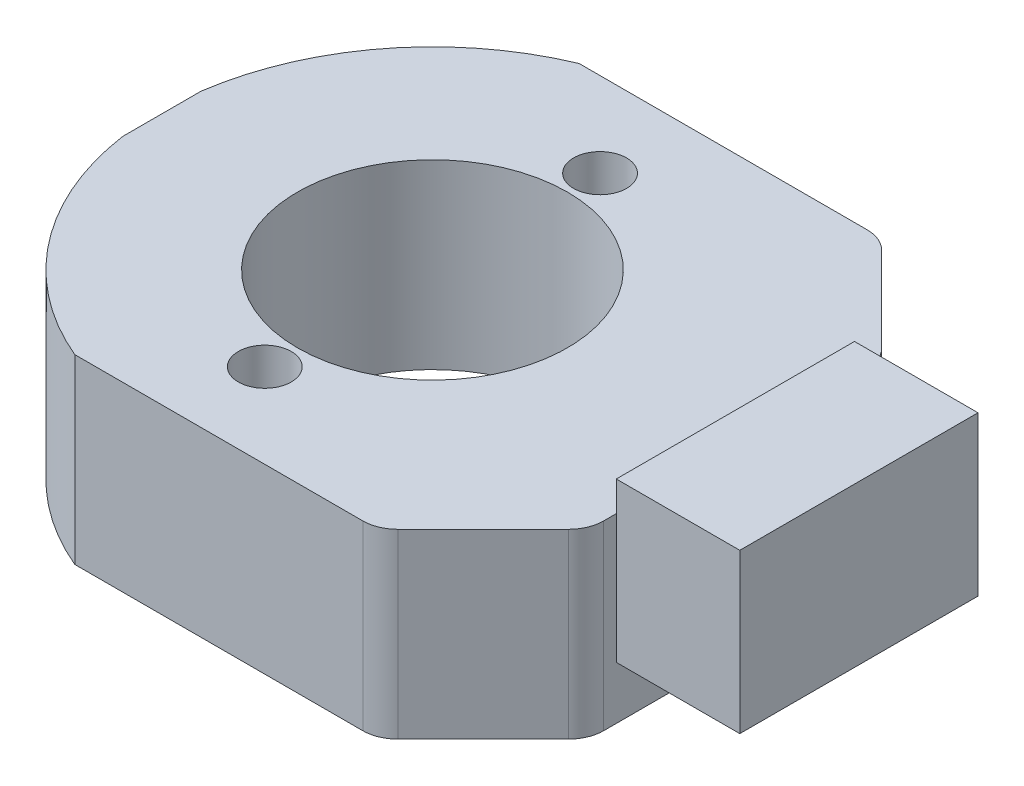
ISO-10303-21;
HEADER;
FILE_DESCRIPTION(('STEP AP214'),'2;1');
FILE_NAME('part.step','',(''),(''),'','','');
FILE_SCHEMA(('AUTOMOTIVE_DESIGN { 1 0 10303 214 1 1 1 1 }'));
ENDSEC;
DATA;
#1=APPLICATION_CONTEXT('core data for automotive mechanical design processes');
#2=APPLICATION_PROTOCOL_DEFINITION('international standard','automotive_design',2000,#1);
#3=PRODUCT_CONTEXT('',#1,'mechanical');
#4=PRODUCT('Part','Part','',(#3));
#5=PRODUCT_RELATED_PRODUCT_CATEGORY('part','',(#4));
#6=PRODUCT_DEFINITION_FORMATION('','',#4);
#7=PRODUCT_DEFINITION_CONTEXT('part definition',#1,'design');
#8=PRODUCT_DEFINITION('design','',#6,#7);
#9=PRODUCT_DEFINITION_SHAPE('','',#8);
#10=(LENGTH_UNIT() NAMED_UNIT(*) SI_UNIT(.MILLI.,.METRE.));
#11=(NAMED_UNIT(*) PLANE_ANGLE_UNIT() SI_UNIT($,.RADIAN.));
#12=(NAMED_UNIT(*) SI_UNIT($,.STERADIAN.) SOLID_ANGLE_UNIT());
#13=UNCERTAINTY_MEASURE_WITH_UNIT(LENGTH_MEASURE(1.E-05),#10,'distance_accuracy_value','');
#14=(GEOMETRIC_REPRESENTATION_CONTEXT(3) GLOBAL_UNCERTAINTY_ASSIGNED_CONTEXT((#13)) GLOBAL_UNIT_ASSIGNED_CONTEXT((#10,
#11,#12)) REPRESENTATION_CONTEXT('',''));
#15=CARTESIAN_POINT('',(0.,0.,0.));
#16=DIRECTION('',(0.,0.,1.));
#17=DIRECTION('',(1.,0.,0.));
#18=AXIS2_PLACEMENT_3D('',#15,#16,#17);
#19=CARTESIAN_POINT('',(17.17,10.3,0.));
#20=DIRECTION('',(1.,0.,0.));
#21=DIRECTION('',(0.,0.,-1.));
#22=AXIS2_PLACEMENT_3D('',#19,#20,#21);
#23=PLANE('',#22);
#24=DIRECTION('',(0.,0.,1.));
#25=VECTOR('',#24,1.);
#26=CARTESIAN_POINT('',(17.17,3.,-6.75));
#27=LINE('',#26,#25);
#28=CARTESIAN_POINT('',(17.17,3.,-6.75));
#29=VERTEX_POINT('',#28);
#30=CARTESIAN_POINT('',(17.17,3.,6.75));
#31=VERTEX_POINT('',#30);
#32=EDGE_CURVE('E58',#29,#31,#27,.T.);
#33=ORIENTED_EDGE('',*,*,#32,.T.);
#34=DIRECTION('',(0.,-1.,0.));
#35=VECTOR('',#34,1.);
#36=CARTESIAN_POINT('',(17.17,12.,6.75));
#37=LINE('',#36,#35);
#38=CARTESIAN_POINT('',(17.17,10.3,6.75));
#39=VERTEX_POINT('',#38);
#40=EDGE_CURVE('E188',#39,#31,#37,.T.);
#41=ORIENTED_EDGE('',*,*,#40,.F.);
#42=DIRECTION('',(0.,0.,1.));
#43=VECTOR('',#42,1.);
#44=CARTESIAN_POINT('',(17.17,10.3,0.));
#45=LINE('',#44,#43);
#46=CARTESIAN_POINT('',(17.17,10.3,7.4615728752538));
#47=VERTEX_POINT('',#46);
#48=EDGE_CURVE('E217',#39,#47,#45,.T.);
#49=ORIENTED_EDGE('',*,*,#48,.T.);
#50=DIRECTION('',(0.,-1.,0.));
#51=VECTOR('',#50,1.);
#52=CARTESIAN_POINT('',(17.17,10.3,7.4615728752538));
#53=LINE('',#52,#51);
#54=CARTESIAN_POINT('',(17.17,0.,7.4615728752538));
#55=VERTEX_POINT('',#54);
#56=EDGE_CURVE('E289',#47,#55,#53,.T.);
#57=ORIENTED_EDGE('',*,*,#56,.T.);
#58=DIRECTION('',(0.,0.,1.));
#59=VECTOR('',#58,1.);
#60=CARTESIAN_POINT('',(17.17,0.,0.));
#61=LINE('',#60,#59);
#62=CARTESIAN_POINT('',(17.17,0.,-7.46157287525379));
#63=VERTEX_POINT('',#62);
#64=EDGE_CURVE('E236',#63,#55,#61,.T.);
#65=ORIENTED_EDGE('',*,*,#64,.F.);
#66=DIRECTION('',(0.,-1.,0.));
#67=VECTOR('',#66,1.);
#68=CARTESIAN_POINT('',(17.17,10.3,-7.46157287525379));
#69=LINE('',#68,#67);
#70=CARTESIAN_POINT('',(17.17,10.3,-7.46157287525379));
#71=VERTEX_POINT('',#70);
#72=EDGE_CURVE('E292',#63,#71,#69,.F.);
#73=ORIENTED_EDGE('',*,*,#72,.T.);
#74=CARTESIAN_POINT('',(17.17,10.3,-6.75));
#75=VERTEX_POINT('',#74);
#76=EDGE_CURVE('E218',#71,#75,#45,.T.);
#77=ORIENTED_EDGE('',*,*,#76,.T.);
#78=DIRECTION('',(0.,-1.,0.));
#79=VECTOR('',#78,1.);
#80=CARTESIAN_POINT('',(17.17,12.,-6.75));
#81=LINE('',#80,#79);
#82=EDGE_CURVE('E63',#75,#29,#81,.T.);
#83=ORIENTED_EDGE('',*,*,#82,.T.);
#84=EDGE_LOOP('',(#33,#41,#49,#57,#65,#73,#77,#83));
#85=FACE_BOUND('',#84,.T.);
#86=ADVANCED_FACE('F43',(#85),#23,.T.);
#87=CARTESIAN_POINT('',(-15.33,10.3,0.));
#88=DIRECTION('',(1.,0.,0.));
#89=DIRECTION('',(0.,0.,-1.));
#90=AXIS2_PLACEMENT_3D('',#87,#88,#89);
#91=PLANE('',#90);
#92=DIRECTION('',(0.,0.,1.));
#93=VECTOR('',#92,1.);
#94=CARTESIAN_POINT('',(-15.33,0.,0.));
#95=LINE('',#94,#93);
#96=CARTESIAN_POINT('',(-15.33,0.,-2.22063054108513));
#97=VERTEX_POINT('',#96);
#98=CARTESIAN_POINT('',(-15.33,0.,2.22063054108513));
#99=VERTEX_POINT('',#98);
#100=EDGE_CURVE('E228',#97,#99,#95,.T.);
#101=ORIENTED_EDGE('',*,*,#100,.T.);
#102=DIRECTION('',(0.,-1.,0.));
#103=VECTOR('',#102,1.);
#104=CARTESIAN_POINT('',(-15.33,10.3,2.22063054108513));
#105=LINE('',#104,#103);
#106=CARTESIAN_POINT('',(-15.33,10.3,2.22063054108513));
#107=VERTEX_POINT('',#106);
#108=EDGE_CURVE('E250',#107,#99,#105,.T.);
#109=ORIENTED_EDGE('',*,*,#108,.F.);
#110=DIRECTION('',(0.,0.,1.));
#111=VECTOR('',#110,1.);
#112=CARTESIAN_POINT('',(-15.33,10.3,0.));
#113=LINE('',#112,#111);
#114=CARTESIAN_POINT('',(-15.33,10.3,-2.22063054108513));
#115=VERTEX_POINT('',#114);
#116=EDGE_CURVE('E208',#115,#107,#113,.T.);
#117=ORIENTED_EDGE('',*,*,#116,.F.);
#118=DIRECTION('',(0.,-1.,0.));
#119=VECTOR('',#118,1.);
#120=CARTESIAN_POINT('',(-15.33,10.3,-2.22063054108513));
#121=LINE('',#120,#119);
#122=EDGE_CURVE('E225',#115,#97,#121,.T.);
#123=ORIENTED_EDGE('',*,*,#122,.T.);
#124=EDGE_LOOP('',(#101,#109,#117,#123));
#125=FACE_BOUND('',#124,.T.);
#126=ADVANCED_FACE('F351',(#125),#91,.F.);
#127=CARTESIAN_POINT('',(0.,10.3,0.));
#128=DIRECTION('',(0.,-1.,0.));
#129=DIRECTION('',(0.,0.,-1.));
#130=AXIS2_PLACEMENT_3D('',#127,#128,#129);
#131=CYLINDRICAL_SURFACE('',#130,15.49);
#132=CARTESIAN_POINT('',(0.,0.,0.));
#133=DIRECTION('',(0.,1.,0.));
#134=DIRECTION('',(0.,0.,1.));
#135=AXIS2_PLACEMENT_3D('',#132,#133,#134);
#136=CIRCLE('',#135,15.49);
#137=CARTESIAN_POINT('',(-5.97795951809647,0.,14.29));
#138=VERTEX_POINT('',#137);
#139=EDGE_CURVE('E231',#99,#138,#136,.T.);
#140=ORIENTED_EDGE('',*,*,#139,.T.);
#141=DIRECTION('',(0.,-1.,0.));
#142=VECTOR('',#141,1.);
#143=CARTESIAN_POINT('',(-5.97795951809647,10.3,14.29));
#144=LINE('',#143,#142);
#145=CARTESIAN_POINT('',(-5.97795951809647,10.3,14.29));
#146=VERTEX_POINT('',#145);
#147=EDGE_CURVE('E247',#146,#138,#144,.T.);
#148=ORIENTED_EDGE('',*,*,#147,.F.);
#149=CARTESIAN_POINT('',(0.,10.3,0.));
#150=DIRECTION('',(0.,1.,0.));
#151=DIRECTION('',(0.,0.,1.));
#152=AXIS2_PLACEMENT_3D('',#149,#150,#151);
#153=CIRCLE('',#152,15.49);
#154=EDGE_CURVE('E212',#107,#146,#153,.T.);
#155=ORIENTED_EDGE('',*,*,#154,.F.);
#156=ORIENTED_EDGE('',*,*,#108,.T.);
#157=EDGE_LOOP('',(#140,#148,#155,#156));
#158=FACE_BOUND('',#157,.T.);
#159=ADVANCED_FACE('F358',(#158),#131,.T.);
#160=CARTESIAN_POINT('',(0.,10.3,14.29));
#161=DIRECTION('',(0.,0.,-1.));
#162=DIRECTION('',(-1.,0.,0.));
#163=AXIS2_PLACEMENT_3D('',#160,#161,#162);
#164=PLANE('',#163);
#165=DIRECTION('',(1.,0.,0.));
#166=VECTOR('',#165,1.);
#167=CARTESIAN_POINT('',(0.,0.,14.29));
#168=LINE('',#167,#166);
#169=CARTESIAN_POINT('',(10.3415728752538,0.,14.29));
#170=VERTEX_POINT('',#169);
#171=EDGE_CURVE('E233',#138,#170,#168,.T.);
#172=ORIENTED_EDGE('',*,*,#171,.T.);
#173=DIRECTION('',(0.,1.,0.));
#174=VECTOR('',#173,1.);
#175=CARTESIAN_POINT('',(10.3415728752538,10.3,14.29));
#176=LINE('',#175,#174);
#177=CARTESIAN_POINT('',(10.3415728752538,10.3,14.29));
#178=VERTEX_POINT('',#177);
#179=EDGE_CURVE('E11',#170,#178,#176,.T.);
#180=ORIENTED_EDGE('',*,*,#179,.T.);
#181=DIRECTION('',(1.,0.,0.));
#182=VECTOR('',#181,1.);
#183=CARTESIAN_POINT('',(0.,10.3,14.29));
#184=LINE('',#183,#182);
#185=EDGE_CURVE('E214',#146,#178,#184,.T.);
#186=ORIENTED_EDGE('',*,*,#185,.F.);
#187=ORIENTED_EDGE('',*,*,#147,.T.);
#188=EDGE_LOOP('',(#172,#180,#186,#187));
#189=FACE_BOUND('',#188,.T.);
#190=ADVANCED_FACE('F365',(#189),#164,.F.);
#191=CARTESIAN_POINT('',(0.,10.3,-14.29));
#192=DIRECTION('',(0.,0.,-1.));
#193=DIRECTION('',(-1.,0.,0.));
#194=AXIS2_PLACEMENT_3D('',#191,#192,#193);
#195=PLANE('',#194);
#196=DIRECTION('',(1.,0.,0.));
#197=VECTOR('',#196,1.);
#198=CARTESIAN_POINT('',(0.,10.3,-14.29));
#199=LINE('',#198,#197);
#200=CARTESIAN_POINT('',(-5.97795951809646,10.3,-14.29));
#201=VERTEX_POINT('',#200);
#202=CARTESIAN_POINT('',(10.3415728752538,10.3,-14.29));
#203=VERTEX_POINT('',#202);
#204=EDGE_CURVE('E220',#201,#203,#199,.T.);
#205=ORIENTED_EDGE('',*,*,#204,.T.);
#206=DIRECTION('',(0.,1.,0.));
#207=VECTOR('',#206,1.);
#208=CARTESIAN_POINT('',(10.3415728752538,10.3,-14.29));
#209=LINE('',#208,#207);
#210=CARTESIAN_POINT('',(10.3415728752538,0.,-14.29));
#211=VERTEX_POINT('',#210);
#212=EDGE_CURVE('E265',#203,#211,#209,.F.);
#213=ORIENTED_EDGE('',*,*,#212,.T.);
#214=DIRECTION('',(1.,0.,0.));
#215=VECTOR('',#214,1.);
#216=CARTESIAN_POINT('',(0.,0.,-14.29));
#217=LINE('',#216,#215);
#218=CARTESIAN_POINT('',(-5.97795951809646,0.,-14.29));
#219=VERTEX_POINT('',#218);
#220=EDGE_CURVE('E239',#219,#211,#217,.T.);
#221=ORIENTED_EDGE('',*,*,#220,.F.);
#222=DIRECTION('',(0.,-1.,0.));
#223=VECTOR('',#222,1.);
#224=CARTESIAN_POINT('',(-5.97795951809646,10.3,-14.29));
#225=LINE('',#224,#223);
#226=EDGE_CURVE('E245',#201,#219,#225,.T.);
#227=ORIENTED_EDGE('',*,*,#226,.F.);
#228=EDGE_LOOP('',(#205,#213,#221,#227));
#229=FACE_BOUND('',#228,.T.);
#230=ADVANCED_FACE('F363',(#229),#195,.T.);
#231=CARTESIAN_POINT('',(0.,10.3,0.));
#232=DIRECTION('',(0.,-1.,0.));
#233=DIRECTION('',(0.,0.,-1.));
#234=AXIS2_PLACEMENT_3D('',#231,#232,#233);
#235=CYLINDRICAL_SURFACE('',#234,7.65);
#236=CARTESIAN_POINT('',(0.,10.3,0.));
#237=DIRECTION('',(0.,1.,0.));
#238=DIRECTION('',(0.,0.,1.));
#239=AXIS2_PLACEMENT_3D('',#236,#237,#238);
#240=CIRCLE('',#239,7.65);
#241=CARTESIAN_POINT('',(0.,10.3,-7.65));
#242=VERTEX_POINT('',#241);
#243=EDGE_CURVE('E205',#242,#242,#240,.T.);
#244=CARTESIAN_POINT('',(0.,0.,0.));
#245=DIRECTION('',(0.,1.,0.));
#246=DIRECTION('',(0.,0.,1.));
#247=AXIS2_PLACEMENT_3D('',#244,#245,#246);
#248=CIRCLE('',#247,7.65);
#249=CARTESIAN_POINT('',(0.,0.,-7.65));
#250=VERTEX_POINT('',#249);
#251=EDGE_CURVE('E204',#250,#250,#248,.T.);
#252=CARTESIAN_POINT('',(0.,10.3,-7.65));
#253=CARTESIAN_POINT('',(0.,10.1927083333333,-7.65));
#254=CARTESIAN_POINT('',(0.,10.0854166666667,-7.65));
#255=CARTESIAN_POINT('',(0.,9.87083333333333,-7.65));
#256=CARTESIAN_POINT('',(0.,9.76354166666667,-7.65));
#257=CARTESIAN_POINT('',(0.,9.54895833333333,-7.65));
#258=CARTESIAN_POINT('',(0.,9.44166666666667,-7.65));
#259=CARTESIAN_POINT('',(0.,9.22708333333333,-7.65));
#260=CARTESIAN_POINT('',(0.,9.11979166666667,-7.65));
#261=CARTESIAN_POINT('',(0.,8.90520833333333,-7.65));
#262=CARTESIAN_POINT('',(0.,8.79791666666667,-7.65));
#263=CARTESIAN_POINT('',(0.,8.58333333333333,-7.65));
#264=CARTESIAN_POINT('',(0.,8.47604166666667,-7.65));
#265=CARTESIAN_POINT('',(0.,8.26145833333333,-7.65));
#266=CARTESIAN_POINT('',(0.,8.15416666666667,-7.65));
#267=CARTESIAN_POINT('',(0.,7.93958333333333,-7.65));
#268=CARTESIAN_POINT('',(0.,7.83229166666667,-7.65));
#269=CARTESIAN_POINT('',(0.,7.61770833333333,-7.65));
#270=CARTESIAN_POINT('',(0.,7.51041666666667,-7.65));
#271=CARTESIAN_POINT('',(0.,7.29583333333333,-7.65));
#272=CARTESIAN_POINT('',(0.,7.18854166666667,-7.65));
#273=CARTESIAN_POINT('',(0.,6.97395833333333,-7.65));
#274=CARTESIAN_POINT('',(0.,6.86666666666667,-7.65));
#275=CARTESIAN_POINT('',(0.,6.65208333333333,-7.65));
#276=CARTESIAN_POINT('',(0.,6.54479166666667,-7.65));
#277=CARTESIAN_POINT('',(0.,6.33020833333333,-7.65));
#278=CARTESIAN_POINT('',(0.,6.22291666666667,-7.65));
#279=CARTESIAN_POINT('',(0.,6.00833333333333,-7.65));
#280=CARTESIAN_POINT('',(0.,5.90104166666667,-7.65));
#281=CARTESIAN_POINT('',(0.,5.68645833333333,-7.65));
#282=CARTESIAN_POINT('',(0.,5.57916666666667,-7.65));
#283=CARTESIAN_POINT('',(0.,5.36458333333333,-7.65));
#284=CARTESIAN_POINT('',(0.,5.25729166666667,-7.65));
#285=CARTESIAN_POINT('',(0.,5.04270833333333,-7.65));
#286=CARTESIAN_POINT('',(0.,4.93541666666667,-7.65));
#287=CARTESIAN_POINT('',(0.,4.72083333333333,-7.65));
#288=CARTESIAN_POINT('',(0.,4.61354166666667,-7.65));
#289=CARTESIAN_POINT('',(0.,4.39895833333333,-7.65));
#290=CARTESIAN_POINT('',(0.,4.29166666666667,-7.65));
#291=CARTESIAN_POINT('',(0.,4.07708333333333,-7.65));
#292=CARTESIAN_POINT('',(0.,3.96979166666667,-7.65));
#293=CARTESIAN_POINT('',(0.,3.75520833333333,-7.65));
#294=CARTESIAN_POINT('',(0.,3.64791666666667,-7.65));
#295=CARTESIAN_POINT('',(0.,3.43333333333333,-7.65));
#296=CARTESIAN_POINT('',(0.,3.32604166666667,-7.65));
#297=CARTESIAN_POINT('',(0.,3.11145833333333,-7.65));
#298=CARTESIAN_POINT('',(0.,3.00416666666667,-7.65));
#299=CARTESIAN_POINT('',(0.,2.78958333333333,-7.65));
#300=CARTESIAN_POINT('',(0.,2.68229166666667,-7.65));
#301=CARTESIAN_POINT('',(0.,2.46770833333333,-7.65));
#302=CARTESIAN_POINT('',(0.,2.36041666666667,-7.65));
#303=CARTESIAN_POINT('',(0.,2.14583333333333,-7.65));
#304=CARTESIAN_POINT('',(0.,2.03854166666667,-7.65));
#305=CARTESIAN_POINT('',(0.,1.82395833333333,-7.65));
#306=CARTESIAN_POINT('',(0.,1.71666666666667,-7.65));
#307=CARTESIAN_POINT('',(0.,1.50208333333333,-7.65));
#308=CARTESIAN_POINT('',(0.,1.39479166666667,-7.65));
#309=CARTESIAN_POINT('',(0.,1.18020833333333,-7.65));
#310=CARTESIAN_POINT('',(0.,1.07291666666666,-7.65));
#311=CARTESIAN_POINT('',(0.,0.858333333333331,-7.65));
#312=CARTESIAN_POINT('',(0.,0.751041666666665,-7.65));
#313=CARTESIAN_POINT('',(0.,0.536458333333331,-7.65));
#314=CARTESIAN_POINT('',(0.,0.429166666666664,-7.65));
#315=CARTESIAN_POINT('',(0.,0.214583333333331,-7.65));
#316=CARTESIAN_POINT('',(0.,0.107291666666665,-7.65));
#317=CARTESIAN_POINT('',(0.,0.,-7.65));
#318=B_SPLINE_CURVE_WITH_KNOTS('',3,(#252,#253,#254,#255,#256,#257,#258,#259,#260,#261,#262,
#263,#264,#265,#266,#267,#268,#269,#270,#271,#272,#273,#274,#275,#276,#277,#278,#279,#280,#281,
#282,#283,#284,#285,#286,#287,#288,#289,#290,#291,#292,#293,#294,#295,#296,#297,#298,#299,#300,
#301,#302,#303,#304,#305,#306,#307,#308,#309,#310,#311,#312,#313,#314,#315,#316,#317),
.UNSPECIFIED.,.F.,.F.,(4,2,2,2,2,2,2,2,2,2,2,2,2,2,2,2,2,2,2,2,2,2,2,2,2,2,2,2,2,2,2,2,4),(0.,
0.321874999999999,0.643749999999998,0.965625,1.2875,1.609375,1.93125,2.253125,2.575,2.896875,
3.21875,3.540625,3.8625,4.184375,4.50625,4.828125,5.15,5.471875,5.79375,6.115625,6.4375,
6.759375,7.08125,7.403125,7.725,8.046875,8.36875,8.690625,9.0125,9.334375,9.65625,9.978125,
10.3),.UNSPECIFIED.);
#319=EDGE_CURVE('BSEAM372',#242,#250,#318,.T.);
#320=ORIENTED_EDGE('',*,*,#243,.T.);
#321=ORIENTED_EDGE('',*,*,#251,.F.);
#322=ORIENTED_EDGE('',*,*,#319,.T.);
#323=ORIENTED_EDGE('',*,*,#319,.F.);
#324=EDGE_LOOP('',(#320,#322,#321,#323));
#325=FACE_BOUND('',#324,.T.);
#326=ADVANCED_FACE('F372',(#325),#235,.F.);
#327=CARTESIAN_POINT('',(0.,10.3,0.));
#328=DIRECTION('',(0.,-1.,0.));
#329=DIRECTION('',(0.,0.,-1.));
#330=AXIS2_PLACEMENT_3D('',#327,#328,#329);
#331=CYLINDRICAL_SURFACE('',#330,15.49);
#332=CARTESIAN_POINT('',(0.,0.,0.));
#333=DIRECTION('',(0.,1.,0.));
#334=DIRECTION('',(0.,0.,1.));
#335=AXIS2_PLACEMENT_3D('',#332,#333,#334);
#336=CIRCLE('',#335,15.49);
#337=EDGE_CURVE('E209',#219,#97,#336,.T.);
#338=ORIENTED_EDGE('',*,*,#337,.T.);
#339=ORIENTED_EDGE('',*,*,#122,.F.);
#340=CARTESIAN_POINT('',(0.,10.3,0.));
#341=DIRECTION('',(0.,1.,0.));
#342=DIRECTION('',(0.,0.,1.));
#343=AXIS2_PLACEMENT_3D('',#340,#341,#342);
#344=CIRCLE('',#343,15.49);
#345=EDGE_CURVE('E223',#201,#115,#344,.T.);
#346=ORIENTED_EDGE('',*,*,#345,.F.);
#347=ORIENTED_EDGE('',*,*,#226,.T.);
#348=EDGE_LOOP('',(#338,#339,#346,#347));
#349=FACE_BOUND('',#348,.T.);
#350=ADVANCED_FACE('F375',(#349),#331,.T.);
#351=CARTESIAN_POINT('',(0.,10.3,0.));
#352=DIRECTION('',(0.,1.,0.));
#353=DIRECTION('',(0.,0.,1.));
#354=AXIS2_PLACEMENT_3D('',#351,#352,#353);
#355=PLANE('',#354);
#356=CARTESIAN_POINT('',(0.,10.3,9.5));
#357=DIRECTION('',(0.,1.,0.));
#358=DIRECTION('',(0.,0.,1.));
#359=AXIS2_PLACEMENT_3D('',#356,#357,#358);
#360=CIRCLE('',#359,1.5);
#361=CARTESIAN_POINT('',(0.,10.3,8.));
#362=VERTEX_POINT('',#361);
#363=EDGE_CURVE('E201',#362,#362,#360,.T.);
#364=ORIENTED_EDGE('',*,*,#363,.F.);
#365=EDGE_LOOP('',(#364));
#366=FACE_BOUND('',#365,.T.);
#367=CARTESIAN_POINT('',(0.,10.3,-9.5));
#368=DIRECTION('',(0.,1.,0.));
#369=DIRECTION('',(0.,0.,1.));
#370=AXIS2_PLACEMENT_3D('',#367,#368,#369);
#371=CIRCLE('',#370,1.5);
#372=CARTESIAN_POINT('',(0.,10.3,-11.));
#373=VERTEX_POINT('',#372);
#374=EDGE_CURVE('E197',#373,#373,#371,.T.);
#375=ORIENTED_EDGE('',*,*,#374,.F.);
#376=EDGE_LOOP('',(#375));
#377=FACE_BOUND('',#376,.T.);
#378=ORIENTED_EDGE('',*,*,#243,.F.);
#379=EDGE_LOOP('',(#378));
#380=FACE_BOUND('',#379,.T.);
#381=DIRECTION('',(0.707106781186547,0.,0.707106781186548));
#382=VECTOR('',#381,1.);
#383=CARTESIAN_POINT('',(12.73,10.3,-12.73));
#384=LINE('',#383,#382);
#385=CARTESIAN_POINT('',(16.5842135623731,10.3,-8.87578643762689));
#386=VERTEX_POINT('',#385);
#387=CARTESIAN_POINT('',(11.7557864376269,10.3,-13.7042135623731));
#388=VERTEX_POINT('',#387);
#389=EDGE_CURVE('E262',#386,#388,#384,.F.);
#390=ORIENTED_EDGE('',*,*,#389,.T.);
#391=CARTESIAN_POINT('',(10.3415728752538,10.3,-12.29));
#392=DIRECTION('',(0.,1.,0.));
#393=DIRECTION('',(0.,0.,1.));
#394=AXIS2_PLACEMENT_3D('',#391,#392,#393);
#395=CIRCLE('',#394,2.);
#396=EDGE_CURVE('E287',#388,#203,#395,.T.);
#397=ORIENTED_EDGE('',*,*,#396,.T.);
#398=ORIENTED_EDGE('',*,*,#204,.F.);
#399=ORIENTED_EDGE('',*,*,#345,.T.);
#400=ORIENTED_EDGE('',*,*,#116,.T.);
#401=ORIENTED_EDGE('',*,*,#154,.T.);
#402=ORIENTED_EDGE('',*,*,#185,.T.);
#403=CARTESIAN_POINT('',(10.3415728752538,10.3,12.29));
#404=DIRECTION('',(0.,1.,0.));
#405=DIRECTION('',(0.,0.,1.));
#406=AXIS2_PLACEMENT_3D('',#403,#404,#405);
#407=CIRCLE('',#406,2.);
#408=CARTESIAN_POINT('',(11.7557864376269,10.3,13.7042135623731));
#409=VERTEX_POINT('',#408);
#410=EDGE_CURVE('E280',#178,#409,#407,.T.);
#411=ORIENTED_EDGE('',*,*,#410,.T.);
#412=DIRECTION('',(0.707106781186548,0.,-0.707106781186547));
#413=VECTOR('',#412,1.);
#414=CARTESIAN_POINT('',(12.73,10.3,12.73));
#415=LINE('',#414,#413);
#416=CARTESIAN_POINT('',(16.5842135623731,10.3,8.8757864376269));
#417=VERTEX_POINT('',#416);
#418=EDGE_CURVE('E259',#409,#417,#415,.T.);
#419=ORIENTED_EDGE('',*,*,#418,.T.);
#420=CARTESIAN_POINT('',(15.17,10.3,7.4615728752538));
#421=DIRECTION('',(0.,1.,0.));
#422=DIRECTION('',(0.,0.,1.));
#423=AXIS2_PLACEMENT_3D('',#420,#421,#422);
#424=CIRCLE('',#423,2.);
#425=EDGE_CURVE('E282',#417,#47,#424,.T.);
#426=ORIENTED_EDGE('',*,*,#425,.T.);
#427=ORIENTED_EDGE('',*,*,#48,.F.);
#428=EDGE_CURVE('E186',#75,#39,#45,.T.);
#429=ORIENTED_EDGE('',*,*,#428,.F.);
#430=ORIENTED_EDGE('',*,*,#76,.F.);
#431=CARTESIAN_POINT('',(15.17,10.3,-7.46157287525379));
#432=DIRECTION('',(0.,1.,0.));
#433=DIRECTION('',(0.,0.,1.));
#434=AXIS2_PLACEMENT_3D('',#431,#432,#433);
#435=CIRCLE('',#434,2.);
#436=EDGE_CURVE('E285',#71,#386,#435,.T.);
#437=ORIENTED_EDGE('',*,*,#436,.T.);
#438=EDGE_LOOP('',(#390,#397,#398,#399,#400,#401,#402,#411,#419,#426,#427,#429,#430,#437));
#439=FACE_BOUND('',#438,.T.);
#440=ADVANCED_FACE('F305',(#366,#377,#380,#439),#355,.T.);
#441=CARTESIAN_POINT('',(0.,0.,0.));
#442=DIRECTION('',(0.,1.,0.));
#443=DIRECTION('',(0.,0.,1.));
#444=AXIS2_PLACEMENT_3D('',#441,#442,#443);
#445=PLANE('',#444);
#446=CARTESIAN_POINT('',(0.,0.,9.5));
#447=DIRECTION('',(0.,-1.,0.));
#448=DIRECTION('',(0.,0.,-1.));
#449=AXIS2_PLACEMENT_3D('',#446,#447,#448);
#450=CIRCLE('',#449,1.5);
#451=CARTESIAN_POINT('',(0.,0.,8.));
#452=VERTEX_POINT('',#451);
#453=EDGE_CURVE('E191',#452,#452,#450,.T.);
#454=ORIENTED_EDGE('',*,*,#453,.F.);
#455=EDGE_LOOP('',(#454));
#456=FACE_BOUND('',#455,.T.);
#457=CARTESIAN_POINT('',(0.,0.,-9.5));
#458=DIRECTION('',(0.,-1.,0.));
#459=DIRECTION('',(0.,0.,1.));
#460=AXIS2_PLACEMENT_3D('',#457,#458,#459);
#461=CIRCLE('',#460,1.5);
#462=CARTESIAN_POINT('',(0.,0.,-11.));
#463=VERTEX_POINT('',#462);
#464=EDGE_CURVE('E187',#463,#463,#461,.T.);
#465=ORIENTED_EDGE('',*,*,#464,.F.);
#466=EDGE_LOOP('',(#465));
#467=FACE_BOUND('',#466,.T.);
#468=ORIENTED_EDGE('',*,*,#251,.T.);
#469=EDGE_LOOP('',(#468));
#470=FACE_BOUND('',#469,.T.);
#471=ORIENTED_EDGE('',*,*,#220,.T.);
#472=CARTESIAN_POINT('',(10.3415728752538,0.,-12.29));
#473=DIRECTION('',(0.,1.,0.));
#474=DIRECTION('',(0.,0.,1.));
#475=AXIS2_PLACEMENT_3D('',#472,#473,#474);
#476=CIRCLE('',#475,2.);
#477=CARTESIAN_POINT('',(11.7557864376269,0.,-13.7042135623731));
#478=VERTEX_POINT('',#477);
#479=EDGE_CURVE('E274',#211,#478,#476,.F.);
#480=ORIENTED_EDGE('',*,*,#479,.T.);
#481=DIRECTION('',(-0.707106781186547,0.,-0.707106781186548));
#482=VECTOR('',#481,1.);
#483=CARTESIAN_POINT('',(11.17,0.,-14.29));
#484=LINE('',#483,#482);
#485=CARTESIAN_POINT('',(16.5842135623731,0.,-8.87578643762689));
#486=VERTEX_POINT('',#485);
#487=EDGE_CURVE('E256',#478,#486,#484,.F.);
#488=ORIENTED_EDGE('',*,*,#487,.T.);
#489=CARTESIAN_POINT('',(15.17,0.,-7.46157287525379));
#490=DIRECTION('',(0.,1.,0.));
#491=DIRECTION('',(0.,0.,1.));
#492=AXIS2_PLACEMENT_3D('',#489,#490,#491);
#493=CIRCLE('',#492,2.);
#494=EDGE_CURVE('E272',#486,#63,#493,.F.);
#495=ORIENTED_EDGE('',*,*,#494,.T.);
#496=ORIENTED_EDGE('',*,*,#64,.T.);
#497=CARTESIAN_POINT('',(15.17,0.,7.4615728752538));
#498=DIRECTION('',(0.,1.,0.));
#499=DIRECTION('',(0.,0.,1.));
#500=AXIS2_PLACEMENT_3D('',#497,#498,#499);
#501=CIRCLE('',#500,2.);
#502=CARTESIAN_POINT('',(16.5842135623731,0.,8.8757864376269));
#503=VERTEX_POINT('',#502);
#504=EDGE_CURVE('E270',#55,#503,#501,.F.);
#505=ORIENTED_EDGE('',*,*,#504,.T.);
#506=DIRECTION('',(-0.707106781186548,0.,0.707106781186547));
#507=VECTOR('',#506,1.);
#508=CARTESIAN_POINT('',(17.17,0.,8.28999999999999));
#509=LINE('',#508,#507);
#510=CARTESIAN_POINT('',(11.7557864376269,0.,13.7042135623731));
#511=VERTEX_POINT('',#510);
#512=EDGE_CURVE('E253',#503,#511,#509,.T.);
#513=ORIENTED_EDGE('',*,*,#512,.T.);
#514=CARTESIAN_POINT('',(10.3415728752538,0.,12.29));
#515=DIRECTION('',(0.,1.,0.));
#516=DIRECTION('',(0.,0.,1.));
#517=AXIS2_PLACEMENT_3D('',#514,#515,#516);
#518=CIRCLE('',#517,2.);
#519=EDGE_CURVE('E268',#511,#170,#518,.F.);
#520=ORIENTED_EDGE('',*,*,#519,.T.);
#521=ORIENTED_EDGE('',*,*,#171,.F.);
#522=ORIENTED_EDGE('',*,*,#139,.F.);
#523=ORIENTED_EDGE('',*,*,#100,.F.);
#524=ORIENTED_EDGE('',*,*,#337,.F.);
#525=EDGE_LOOP('',(#471,#480,#488,#495,#496,#505,#513,#520,#521,#522,#523,#524));
#526=FACE_BOUND('',#525,.T.);
#527=ADVANCED_FACE('F311',(#456,#467,#470,#526),#445,.F.);
#528=CARTESIAN_POINT('',(0.,10.5,-9.5));
#529=DIRECTION('',(0.,-1.,0.));
#530=DIRECTION('',(0.,0.,-1.));
#531=AXIS2_PLACEMENT_3D('',#528,#529,#530);
#532=CYLINDRICAL_SURFACE('',#531,1.5);
#533=CARTESIAN_POINT('',(0.,10.3,-11.));
#534=CARTESIAN_POINT('',(0.,10.1927083333333,-11.));
#535=CARTESIAN_POINT('',(0.,10.0854166666667,-11.));
#536=CARTESIAN_POINT('',(0.,9.87083333333333,-11.));
#537=CARTESIAN_POINT('',(0.,9.76354166666667,-11.));
#538=CARTESIAN_POINT('',(0.,9.54895833333333,-11.));
#539=CARTESIAN_POINT('',(0.,9.44166666666667,-11.));
#540=CARTESIAN_POINT('',(0.,9.22708333333333,-11.));
#541=CARTESIAN_POINT('',(0.,9.11979166666667,-11.));
#542=CARTESIAN_POINT('',(0.,8.90520833333333,-11.));
#543=CARTESIAN_POINT('',(0.,8.79791666666667,-11.));
#544=CARTESIAN_POINT('',(0.,8.58333333333333,-11.));
#545=CARTESIAN_POINT('',(0.,8.47604166666667,-11.));
#546=CARTESIAN_POINT('',(0.,8.26145833333333,-11.));
#547=CARTESIAN_POINT('',(0.,8.15416666666667,-11.));
#548=CARTESIAN_POINT('',(0.,7.93958333333333,-11.));
#549=CARTESIAN_POINT('',(0.,7.83229166666667,-11.));
#550=CARTESIAN_POINT('',(0.,7.61770833333333,-11.));
#551=CARTESIAN_POINT('',(0.,7.51041666666667,-11.));
#552=CARTESIAN_POINT('',(0.,7.29583333333333,-11.));
#553=CARTESIAN_POINT('',(0.,7.18854166666667,-11.));
#554=CARTESIAN_POINT('',(0.,6.97395833333333,-11.));
#555=CARTESIAN_POINT('',(0.,6.86666666666667,-11.));
#556=CARTESIAN_POINT('',(0.,6.65208333333333,-11.));
#557=CARTESIAN_POINT('',(0.,6.54479166666667,-11.));
#558=CARTESIAN_POINT('',(0.,6.33020833333333,-11.));
#559=CARTESIAN_POINT('',(0.,6.22291666666667,-11.));
#560=CARTESIAN_POINT('',(0.,6.00833333333333,-11.));
#561=CARTESIAN_POINT('',(0.,5.90104166666667,-11.));
#562=CARTESIAN_POINT('',(0.,5.68645833333333,-11.));
#563=CARTESIAN_POINT('',(0.,5.57916666666667,-11.));
#564=CARTESIAN_POINT('',(0.,5.36458333333333,-11.));
#565=CARTESIAN_POINT('',(0.,5.25729166666667,-11.));
#566=CARTESIAN_POINT('',(0.,5.04270833333333,-11.));
#567=CARTESIAN_POINT('',(0.,4.93541666666667,-11.));
#568=CARTESIAN_POINT('',(0.,4.72083333333333,-11.));
#569=CARTESIAN_POINT('',(0.,4.61354166666667,-11.));
#570=CARTESIAN_POINT('',(0.,4.39895833333333,-11.));
#571=CARTESIAN_POINT('',(0.,4.29166666666667,-11.));
#572=CARTESIAN_POINT('',(0.,4.07708333333333,-11.));
#573=CARTESIAN_POINT('',(0.,3.96979166666667,-11.));
#574=CARTESIAN_POINT('',(0.,3.75520833333333,-11.));
#575=CARTESIAN_POINT('',(0.,3.64791666666667,-11.));
#576=CARTESIAN_POINT('',(0.,3.43333333333333,-11.));
#577=CARTESIAN_POINT('',(0.,3.32604166666667,-11.));
#578=CARTESIAN_POINT('',(0.,3.11145833333333,-11.));
#579=CARTESIAN_POINT('',(0.,3.00416666666667,-11.));
#580=CARTESIAN_POINT('',(0.,2.78958333333333,-11.));
#581=CARTESIAN_POINT('',(0.,2.68229166666667,-11.));
#582=CARTESIAN_POINT('',(0.,2.46770833333333,-11.));
#583=CARTESIAN_POINT('',(0.,2.36041666666667,-11.));
#584=CARTESIAN_POINT('',(0.,2.14583333333333,-11.));
#585=CARTESIAN_POINT('',(0.,2.03854166666667,-11.));
#586=CARTESIAN_POINT('',(0.,1.82395833333333,-11.));
#587=CARTESIAN_POINT('',(0.,1.71666666666667,-11.));
#588=CARTESIAN_POINT('',(0.,1.50208333333333,-11.));
#589=CARTESIAN_POINT('',(0.,1.39479166666667,-11.));
#590=CARTESIAN_POINT('',(0.,1.18020833333333,-11.));
#591=CARTESIAN_POINT('',(0.,1.07291666666667,-11.));
#592=CARTESIAN_POINT('',(0.,0.858333333333333,-11.));
#593=CARTESIAN_POINT('',(0.,0.751041666666667,-11.));
#594=CARTESIAN_POINT('',(0.,0.536458333333333,-11.));
#595=CARTESIAN_POINT('',(0.,0.429166666666666,-11.));
#596=CARTESIAN_POINT('',(0.,0.214583333333333,-11.));
#597=CARTESIAN_POINT('',(0.,0.107291666666666,-11.));
#598=CARTESIAN_POINT('',(0.,0.,-11.));
#599=B_SPLINE_CURVE_WITH_KNOTS('',3,(#533,#534,#535,#536,#537,#538,#539,#540,#541,#542,#543,
#544,#545,#546,#547,#548,#549,#550,#551,#552,#553,#554,#555,#556,#557,#558,#559,#560,#561,#562,
#563,#564,#565,#566,#567,#568,#569,#570,#571,#572,#573,#574,#575,#576,#577,#578,#579,#580,#581,
#582,#583,#584,#585,#586,#587,#588,#589,#590,#591,#592,#593,#594,#595,#596,#597,#598),
.UNSPECIFIED.,.F.,.F.,(4,2,2,2,2,2,2,2,2,2,2,2,2,2,2,2,2,2,2,2,2,2,2,2,2,2,2,2,2,2,2,2,4),(0.,
0.321874999999999,0.643749999999998,0.965625,1.2875,1.609375,1.93125,2.253125,2.575,2.896875,
3.21875,3.540625,3.8625,4.184375,4.50625,4.828125,5.15,5.471875,5.79375,6.115625,6.4375,
6.759375,7.08125,7.403125,7.725,8.046875,8.36875,8.690625,9.0125,9.334375,9.65625,9.978125,
10.3),.UNSPECIFIED.);
#600=EDGE_CURVE('BSEAM434',#373,#463,#599,.T.);
#601=ORIENTED_EDGE('',*,*,#374,.T.);
#602=ORIENTED_EDGE('',*,*,#464,.T.);
#603=ORIENTED_EDGE('',*,*,#600,.T.);
#604=ORIENTED_EDGE('',*,*,#600,.F.);
#605=EDGE_LOOP('',(#601,#603,#602,#604));
#606=FACE_BOUND('',#605,.T.);
#607=ADVANCED_FACE('F434',(#606),#532,.F.);
#608=CARTESIAN_POINT('',(0.,10.5,9.5));
#609=DIRECTION('',(0.,-1.,0.));
#610=DIRECTION('',(0.,0.,-1.));
#611=AXIS2_PLACEMENT_3D('',#608,#609,#610);
#612=CYLINDRICAL_SURFACE('',#611,1.5);
#613=CARTESIAN_POINT('',(0.,10.3,8.));
#614=CARTESIAN_POINT('',(0.,10.1927083333333,8.));
#615=CARTESIAN_POINT('',(0.,10.0854166666667,8.));
#616=CARTESIAN_POINT('',(0.,9.87083333333333,8.));
#617=CARTESIAN_POINT('',(0.,9.76354166666667,8.));
#618=CARTESIAN_POINT('',(0.,9.54895833333333,8.));
#619=CARTESIAN_POINT('',(0.,9.44166666666667,8.));
#620=CARTESIAN_POINT('',(0.,9.22708333333333,8.));
#621=CARTESIAN_POINT('',(0.,9.11979166666667,8.));
#622=CARTESIAN_POINT('',(0.,8.90520833333333,8.));
#623=CARTESIAN_POINT('',(0.,8.79791666666667,8.));
#624=CARTESIAN_POINT('',(0.,8.58333333333333,8.));
#625=CARTESIAN_POINT('',(0.,8.47604166666667,8.));
#626=CARTESIAN_POINT('',(0.,8.26145833333333,8.));
#627=CARTESIAN_POINT('',(0.,8.15416666666667,8.));
#628=CARTESIAN_POINT('',(0.,7.93958333333333,8.));
#629=CARTESIAN_POINT('',(0.,7.83229166666667,8.));
#630=CARTESIAN_POINT('',(0.,7.61770833333333,8.));
#631=CARTESIAN_POINT('',(0.,7.51041666666667,8.));
#632=CARTESIAN_POINT('',(0.,7.29583333333333,8.));
#633=CARTESIAN_POINT('',(0.,7.18854166666667,8.));
#634=CARTESIAN_POINT('',(0.,6.97395833333333,8.));
#635=CARTESIAN_POINT('',(0.,6.86666666666667,8.));
#636=CARTESIAN_POINT('',(0.,6.65208333333333,8.));
#637=CARTESIAN_POINT('',(0.,6.54479166666667,8.));
#638=CARTESIAN_POINT('',(0.,6.33020833333333,8.));
#639=CARTESIAN_POINT('',(0.,6.22291666666667,8.));
#640=CARTESIAN_POINT('',(0.,6.00833333333333,8.));
#641=CARTESIAN_POINT('',(0.,5.90104166666667,8.));
#642=CARTESIAN_POINT('',(0.,5.68645833333333,8.));
#643=CARTESIAN_POINT('',(0.,5.57916666666667,8.));
#644=CARTESIAN_POINT('',(0.,5.36458333333333,8.));
#645=CARTESIAN_POINT('',(0.,5.25729166666667,8.));
#646=CARTESIAN_POINT('',(0.,5.04270833333333,8.));
#647=CARTESIAN_POINT('',(0.,4.93541666666667,8.));
#648=CARTESIAN_POINT('',(0.,4.72083333333333,8.));
#649=CARTESIAN_POINT('',(0.,4.61354166666667,8.));
#650=CARTESIAN_POINT('',(0.,4.39895833333333,8.));
#651=CARTESIAN_POINT('',(0.,4.29166666666667,8.));
#652=CARTESIAN_POINT('',(0.,4.07708333333333,8.));
#653=CARTESIAN_POINT('',(0.,3.96979166666667,8.));
#654=CARTESIAN_POINT('',(0.,3.75520833333333,8.));
#655=CARTESIAN_POINT('',(0.,3.64791666666667,8.));
#656=CARTESIAN_POINT('',(0.,3.43333333333333,8.));
#657=CARTESIAN_POINT('',(0.,3.32604166666667,8.));
#658=CARTESIAN_POINT('',(0.,3.11145833333333,8.));
#659=CARTESIAN_POINT('',(0.,3.00416666666667,8.));
#660=CARTESIAN_POINT('',(0.,2.78958333333333,8.));
#661=CARTESIAN_POINT('',(0.,2.68229166666667,8.));
#662=CARTESIAN_POINT('',(0.,2.46770833333333,8.));
#663=CARTESIAN_POINT('',(0.,2.36041666666667,8.));
#664=CARTESIAN_POINT('',(0.,2.14583333333333,8.));
#665=CARTESIAN_POINT('',(0.,2.03854166666667,8.));
#666=CARTESIAN_POINT('',(0.,1.82395833333333,8.));
#667=CARTESIAN_POINT('',(0.,1.71666666666667,8.));
#668=CARTESIAN_POINT('',(0.,1.50208333333333,8.));
#669=CARTESIAN_POINT('',(0.,1.39479166666667,8.));
#670=CARTESIAN_POINT('',(0.,1.18020833333333,8.));
#671=CARTESIAN_POINT('',(0.,1.07291666666667,8.));
#672=CARTESIAN_POINT('',(0.,0.858333333333333,8.));
#673=CARTESIAN_POINT('',(0.,0.751041666666667,8.));
#674=CARTESIAN_POINT('',(0.,0.536458333333333,8.));
#675=CARTESIAN_POINT('',(0.,0.429166666666666,8.));
#676=CARTESIAN_POINT('',(0.,0.214583333333333,8.));
#677=CARTESIAN_POINT('',(0.,0.107291666666666,8.));
#678=CARTESIAN_POINT('',(0.,0.,8.));
#679=B_SPLINE_CURVE_WITH_KNOTS('',3,(#613,#614,#615,#616,#617,#618,#619,#620,#621,#622,#623,
#624,#625,#626,#627,#628,#629,#630,#631,#632,#633,#634,#635,#636,#637,#638,#639,#640,#641,#642,
#643,#644,#645,#646,#647,#648,#649,#650,#651,#652,#653,#654,#655,#656,#657,#658,#659,#660,#661,
#662,#663,#664,#665,#666,#667,#668,#669,#670,#671,#672,#673,#674,#675,#676,#677,#678),
.UNSPECIFIED.,.F.,.F.,(4,2,2,2,2,2,2,2,2,2,2,2,2,2,2,2,2,2,2,2,2,2,2,2,2,2,2,2,2,2,2,2,4),(0.,
0.321874999999999,0.643749999999998,0.965625,1.2875,1.609375,1.93125,2.253125,2.575,2.896875,
3.21875,3.540625,3.8625,4.184375,4.50625,4.828125,5.15,5.471875,5.79375,6.115625,6.4375,
6.759375,7.08125,7.403125,7.725,8.046875,8.36875,8.690625,9.0125,9.334375,9.65625,9.978125,
10.3),.UNSPECIFIED.);
#680=EDGE_CURVE('BSEAM384',#362,#452,#679,.T.);
#681=ORIENTED_EDGE('',*,*,#363,.T.);
#682=ORIENTED_EDGE('',*,*,#453,.T.);
#683=ORIENTED_EDGE('',*,*,#680,.T.);
#684=ORIENTED_EDGE('',*,*,#680,.F.);
#685=EDGE_LOOP('',(#681,#683,#682,#684));
#686=FACE_BOUND('',#685,.T.);
#687=ADVANCED_FACE('F384',(#686),#612,.F.);
#688=CARTESIAN_POINT('',(11.17,10.3,-14.29));
#689=DIRECTION('',(-0.707106781186548,0.,0.707106781186547));
#690=DIRECTION('',(0.,-1.,0.));
#691=AXIS2_PLACEMENT_3D('',#688,#689,#690);
#692=PLANE('',#691);
#693=ORIENTED_EDGE('',*,*,#487,.F.);
#694=DIRECTION('',(0.,-1.,0.));
#695=VECTOR('',#694,1.);
#696=CARTESIAN_POINT('',(11.7557864376269,10.3,-13.7042135623731));
#697=LINE('',#696,#695);
#698=EDGE_CURVE('E278',#478,#388,#697,.F.);
#699=ORIENTED_EDGE('',*,*,#698,.T.);
#700=ORIENTED_EDGE('',*,*,#389,.F.);
#701=DIRECTION('',(0.,1.,0.));
#702=VECTOR('',#701,1.);
#703=CARTESIAN_POINT('',(16.5842135623731,10.3,-8.87578643762689));
#704=LINE('',#703,#702);
#705=EDGE_CURVE('E276',#386,#486,#704,.F.);
#706=ORIENTED_EDGE('',*,*,#705,.T.);
#707=EDGE_LOOP('',(#693,#699,#700,#706));
#708=FACE_BOUND('',#707,.T.);
#709=ADVANCED_FACE('F378',(#708),#692,.F.);
#710=CARTESIAN_POINT('',(17.17,10.3,8.28999999999999));
#711=DIRECTION('',(0.707106781186547,0.,0.707106781186548));
#712=DIRECTION('',(0.,1.,0.));
#713=AXIS2_PLACEMENT_3D('',#710,#711,#712);
#714=PLANE('',#713);
#715=ORIENTED_EDGE('',*,*,#512,.F.);
#716=DIRECTION('',(0.,-1.,0.));
#717=VECTOR('',#716,1.);
#718=CARTESIAN_POINT('',(16.5842135623731,10.3,8.8757864376269));
#719=LINE('',#718,#717);
#720=EDGE_CURVE('E51',#503,#417,#719,.F.);
#721=ORIENTED_EDGE('',*,*,#720,.T.);
#722=ORIENTED_EDGE('',*,*,#418,.F.);
#723=DIRECTION('',(0.,1.,0.));
#724=VECTOR('',#723,1.);
#725=CARTESIAN_POINT('',(11.7557864376269,0.,13.7042135623731));
#726=LINE('',#725,#724);
#727=EDGE_CURVE('E295',#409,#511,#726,.F.);
#728=ORIENTED_EDGE('',*,*,#727,.T.);
#729=EDGE_LOOP('',(#715,#721,#722,#728));
#730=FACE_BOUND('',#729,.T.);
#731=ADVANCED_FACE('F300',(#730),#714,.T.);
#732=CARTESIAN_POINT('',(10.3415728752538,10.3,-12.29));
#733=DIRECTION('',(0.,1.,0.));
#734=DIRECTION('',(0.,0.,1.));
#735=AXIS2_PLACEMENT_3D('',#732,#733,#734);
#736=CYLINDRICAL_SURFACE('',#735,2.);
#737=ORIENTED_EDGE('',*,*,#396,.F.);
#738=ORIENTED_EDGE('',*,*,#698,.F.);
#739=ORIENTED_EDGE('',*,*,#479,.F.);
#740=ORIENTED_EDGE('',*,*,#212,.F.);
#741=EDGE_LOOP('',(#737,#738,#739,#740));
#742=FACE_BOUND('',#741,.T.);
#743=ADVANCED_FACE('F390',(#742),#736,.T.);
#744=CARTESIAN_POINT('',(15.17,10.3,-7.46157287525379));
#745=DIRECTION('',(0.,-1.,0.));
#746=DIRECTION('',(0.,0.,-1.));
#747=AXIS2_PLACEMENT_3D('',#744,#745,#746);
#748=CYLINDRICAL_SURFACE('',#747,2.);
#749=ORIENTED_EDGE('',*,*,#494,.F.);
#750=ORIENTED_EDGE('',*,*,#705,.F.);
#751=ORIENTED_EDGE('',*,*,#436,.F.);
#752=ORIENTED_EDGE('',*,*,#72,.F.);
#753=EDGE_LOOP('',(#749,#750,#751,#752));
#754=FACE_BOUND('',#753,.T.);
#755=ADVANCED_FACE('F316',(#754),#748,.T.);
#756=CARTESIAN_POINT('',(15.17,10.3,7.4615728752538));
#757=DIRECTION('',(0.,-1.,0.));
#758=DIRECTION('',(0.,0.,-1.));
#759=AXIS2_PLACEMENT_3D('',#756,#757,#758);
#760=CYLINDRICAL_SURFACE('',#759,2.);
#761=ORIENTED_EDGE('',*,*,#425,.F.);
#762=ORIENTED_EDGE('',*,*,#720,.F.);
#763=ORIENTED_EDGE('',*,*,#504,.F.);
#764=ORIENTED_EDGE('',*,*,#56,.F.);
#765=EDGE_LOOP('',(#761,#762,#763,#764));
#766=FACE_BOUND('',#765,.T.);
#767=ADVANCED_FACE('F307',(#766),#760,.T.);
#768=CARTESIAN_POINT('',(10.3415728752538,10.3,12.29));
#769=DIRECTION('',(0.,-1.,0.));
#770=DIRECTION('',(0.,0.,-1.));
#771=AXIS2_PLACEMENT_3D('',#768,#769,#770);
#772=CYLINDRICAL_SURFACE('',#771,2.);
#773=ORIENTED_EDGE('',*,*,#519,.F.);
#774=ORIENTED_EDGE('',*,*,#727,.F.);
#775=ORIENTED_EDGE('',*,*,#410,.F.);
#776=ORIENTED_EDGE('',*,*,#179,.F.);
#777=EDGE_LOOP('',(#773,#774,#775,#776));
#778=FACE_BOUND('',#777,.T.);
#779=ADVANCED_FACE('F45',(#778),#772,.T.);
#780=CARTESIAN_POINT('',(17.17,12.,-6.75));
#781=DIRECTION('',(1.,0.,0.));
#782=DIRECTION('',(0.,0.,-1.));
#783=AXIS2_PLACEMENT_3D('',#780,#781,#782);
#784=PLANE('',#783);
#785=ORIENTED_EDGE('',*,*,#428,.T.);
#786=CARTESIAN_POINT('',(17.17,12.,6.75));
#787=VERTEX_POINT('',#786);
#788=EDGE_CURVE('E167',#787,#39,#37,.T.);
#789=ORIENTED_EDGE('',*,*,#788,.F.);
#790=DIRECTION('',(0.,0.,1.));
#791=VECTOR('',#790,1.);
#792=CARTESIAN_POINT('',(17.17,12.,-6.75));
#793=LINE('',#792,#791);
#794=CARTESIAN_POINT('',(17.17,12.,-6.75));
#795=VERTEX_POINT('',#794);
#796=EDGE_CURVE('E173',#795,#787,#793,.T.);
#797=ORIENTED_EDGE('',*,*,#796,.F.);
#798=EDGE_CURVE('E332',#795,#75,#81,.T.);
#799=ORIENTED_EDGE('',*,*,#798,.T.);
#800=EDGE_LOOP('',(#785,#789,#797,#799));
#801=FACE_BOUND('',#800,.T.);
#802=ADVANCED_FACE('F185',(#801),#784,.F.);
#803=CARTESIAN_POINT('',(17.17,12.,6.75));
#804=DIRECTION('',(0.,0.,-1.));
#805=DIRECTION('',(-1.,0.,0.));
#806=AXIS2_PLACEMENT_3D('',#803,#804,#805);
#807=PLANE('',#806);
#808=DIRECTION('',(1.,0.,0.));
#809=VECTOR('',#808,1.);
#810=CARTESIAN_POINT('',(17.17,3.,6.75));
#811=LINE('',#810,#809);
#812=CARTESIAN_POINT('',(24.17,3.,6.75));
#813=VERTEX_POINT('',#812);
#814=EDGE_CURVE('E320',#31,#813,#811,.T.);
#815=ORIENTED_EDGE('',*,*,#814,.T.);
#816=DIRECTION('',(0.,-1.,0.));
#817=VECTOR('',#816,1.);
#818=CARTESIAN_POINT('',(24.17,12.,6.75));
#819=LINE('',#818,#817);
#820=CARTESIAN_POINT('',(24.17,12.,6.75));
#821=VERTEX_POINT('',#820);
#822=EDGE_CURVE('E169',#821,#813,#819,.T.);
#823=ORIENTED_EDGE('',*,*,#822,.F.);
#824=DIRECTION('',(1.,0.,0.));
#825=VECTOR('',#824,1.);
#826=CARTESIAN_POINT('',(17.17,12.,6.75));
#827=LINE('',#826,#825);
#828=EDGE_CURVE('E163',#787,#821,#827,.T.);
#829=ORIENTED_EDGE('',*,*,#828,.F.);
#830=ORIENTED_EDGE('',*,*,#788,.T.);
#831=ORIENTED_EDGE('',*,*,#40,.T.);
#832=EDGE_LOOP('',(#815,#823,#829,#830,#831));
#833=FACE_BOUND('',#832,.T.);
#834=ADVANCED_FACE('F165',(#833),#807,.F.);
#835=CARTESIAN_POINT('',(24.17,12.,-6.75));
#836=DIRECTION('',(-1.,0.,0.));
#837=DIRECTION('',(0.,0.,1.));
#838=AXIS2_PLACEMENT_3D('',#835,#836,#837);
#839=PLANE('',#838);
#840=DIRECTION('',(0.,0.,-1.));
#841=VECTOR('',#840,1.);
#842=CARTESIAN_POINT('',(24.17,3.,-6.75));
#843=LINE('',#842,#841);
#844=CARTESIAN_POINT('',(24.17,3.,-6.75));
#845=VERTEX_POINT('',#844);
#846=EDGE_CURVE('E325',#813,#845,#843,.T.);
#847=ORIENTED_EDGE('',*,*,#846,.T.);
#848=DIRECTION('',(0.,-1.,0.));
#849=VECTOR('',#848,1.);
#850=CARTESIAN_POINT('',(24.17,12.,-6.75));
#851=LINE('',#850,#849);
#852=CARTESIAN_POINT('',(24.17,12.,-6.75));
#853=VERTEX_POINT('',#852);
#854=EDGE_CURVE('E333',#853,#845,#851,.T.);
#855=ORIENTED_EDGE('',*,*,#854,.F.);
#856=DIRECTION('',(0.,0.,-1.));
#857=VECTOR('',#856,1.);
#858=CARTESIAN_POINT('',(24.17,12.,-6.75));
#859=LINE('',#858,#857);
#860=EDGE_CURVE('E172',#821,#853,#859,.T.);
#861=ORIENTED_EDGE('',*,*,#860,.F.);
#862=ORIENTED_EDGE('',*,*,#822,.T.);
#863=EDGE_LOOP('',(#847,#855,#861,#862));
#864=FACE_BOUND('',#863,.T.);
#865=ADVANCED_FACE('F338',(#864),#839,.F.);
#866=CARTESIAN_POINT('',(17.17,12.,-6.75));
#867=DIRECTION('',(0.,0.,1.));
#868=DIRECTION('',(1.,0.,0.));
#869=AXIS2_PLACEMENT_3D('',#866,#867,#868);
#870=PLANE('',#869);
#871=DIRECTION('',(-1.,0.,0.));
#872=VECTOR('',#871,1.);
#873=CARTESIAN_POINT('',(17.17,3.,-6.75));
#874=LINE('',#873,#872);
#875=EDGE_CURVE('E182',#845,#29,#874,.T.);
#876=ORIENTED_EDGE('',*,*,#875,.T.);
#877=ORIENTED_EDGE('',*,*,#82,.F.);
#878=ORIENTED_EDGE('',*,*,#798,.F.);
#879=DIRECTION('',(-1.,0.,0.));
#880=VECTOR('',#879,1.);
#881=CARTESIAN_POINT('',(17.17,12.,-6.75));
#882=LINE('',#881,#880);
#883=EDGE_CURVE('E178',#853,#795,#882,.T.);
#884=ORIENTED_EDGE('',*,*,#883,.F.);
#885=ORIENTED_EDGE('',*,*,#854,.T.);
#886=EDGE_LOOP('',(#876,#877,#878,#884,#885));
#887=FACE_BOUND('',#886,.T.);
#888=ADVANCED_FACE('F340',(#887),#870,.F.);
#889=CARTESIAN_POINT('',(0.,12.,0.));
#890=DIRECTION('',(0.,1.,0.));
#891=DIRECTION('',(0.,0.,1.));
#892=AXIS2_PLACEMENT_3D('',#889,#890,#891);
#893=PLANE('',#892);
#894=ORIENTED_EDGE('',*,*,#796,.T.);
#895=ORIENTED_EDGE('',*,*,#828,.T.);
#896=ORIENTED_EDGE('',*,*,#860,.T.);
#897=ORIENTED_EDGE('',*,*,#883,.T.);
#898=EDGE_LOOP('',(#894,#895,#896,#897));
#899=FACE_BOUND('',#898,.T.);
#900=ADVANCED_FACE('F176',(#899),#893,.T.);
#901=CARTESIAN_POINT('',(0.,3.,0.));
#902=DIRECTION('',(0.,1.,0.));
#903=DIRECTION('',(0.,0.,1.));
#904=AXIS2_PLACEMENT_3D('',#901,#902,#903);
#905=PLANE('',#904);
#906=ORIENTED_EDGE('',*,*,#32,.F.);
#907=ORIENTED_EDGE('',*,*,#875,.F.);
#908=ORIENTED_EDGE('',*,*,#846,.F.);
#909=ORIENTED_EDGE('',*,*,#814,.F.);
#910=EDGE_LOOP('',(#906,#907,#908,#909));
#911=FACE_BOUND('',#910,.T.);
#912=ADVANCED_FACE('F323',(#911),#905,.F.);
#913=CLOSED_SHELL('',(#86,#126,#159,#190,#230,#326,#350,#440,#527,#607,#687,#709,#731,#743,#755,
#767,#779,#802,#834,#865,#888,#900,#912));
#914=MANIFOLD_SOLID_BREP('B2',#913);
#915=ADVANCED_BREP_SHAPE_REPRESENTATION('',(#18,#914),#14);
#916=SHAPE_DEFINITION_REPRESENTATION(#9,#915);
ENDSEC;
END-ISO-10303-21;
